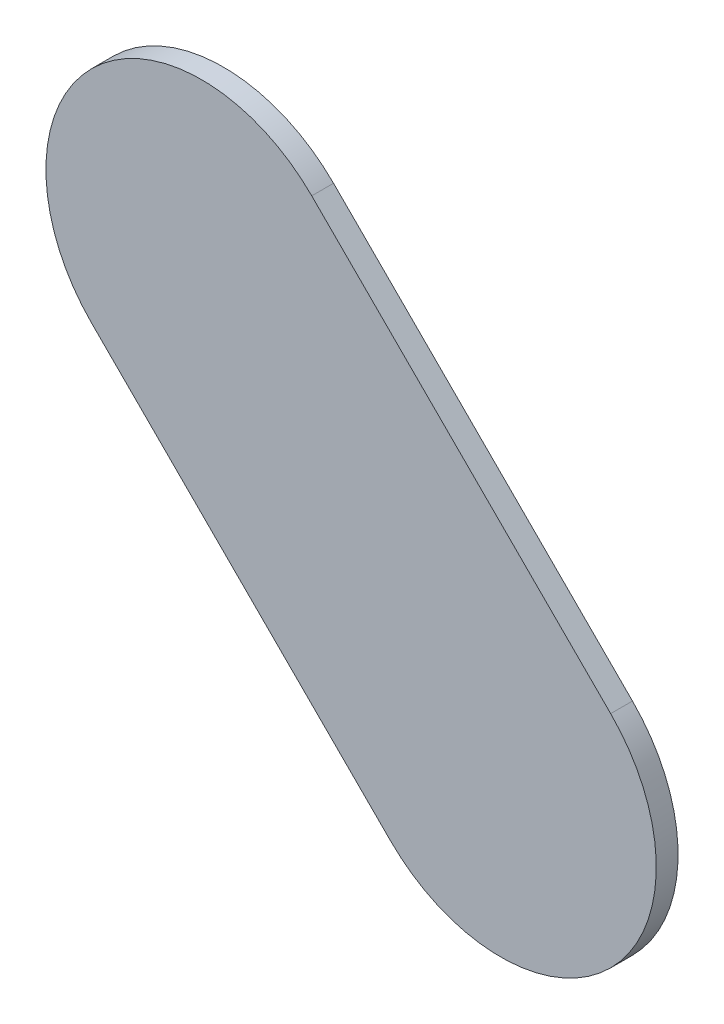
ISO-10303-21;
HEADER;
FILE_DESCRIPTION(('STEP AP214'),'2;1');
FILE_NAME('part.step','',(''),(''),'','','');
FILE_SCHEMA(('AUTOMOTIVE_DESIGN { 1 0 10303 214 1 1 1 1 }'));
ENDSEC;
DATA;
#1=APPLICATION_CONTEXT('core data for automotive mechanical design processes');
#2=APPLICATION_PROTOCOL_DEFINITION('international standard','automotive_design',2000,#1);
#3=PRODUCT_CONTEXT('',#1,'mechanical');
#4=PRODUCT('Part','Part','',(#3));
#5=PRODUCT_RELATED_PRODUCT_CATEGORY('part','',(#4));
#6=PRODUCT_DEFINITION_FORMATION('','',#4);
#7=PRODUCT_DEFINITION_CONTEXT('part definition',#1,'design');
#8=PRODUCT_DEFINITION('design','',#6,#7);
#9=PRODUCT_DEFINITION_SHAPE('','',#8);
#10=(LENGTH_UNIT() NAMED_UNIT(*) SI_UNIT(.MILLI.,.METRE.));
#11=(NAMED_UNIT(*) PLANE_ANGLE_UNIT() SI_UNIT($,.RADIAN.));
#12=(NAMED_UNIT(*) SI_UNIT($,.STERADIAN.) SOLID_ANGLE_UNIT());
#13=UNCERTAINTY_MEASURE_WITH_UNIT(LENGTH_MEASURE(1.E-05),#10,'distance_accuracy_value','');
#14=(GEOMETRIC_REPRESENTATION_CONTEXT(3) GLOBAL_UNCERTAINTY_ASSIGNED_CONTEXT((#13)) GLOBAL_UNIT_ASSIGNED_CONTEXT((#10,
#11,#12)) REPRESENTATION_CONTEXT('',''));
#15=CARTESIAN_POINT('',(0.,0.,0.));
#16=DIRECTION('',(0.,0.,1.));
#17=DIRECTION('',(1.,0.,0.));
#18=AXIS2_PLACEMENT_3D('',#15,#16,#17);
#19=CARTESIAN_POINT('',(101.946777,-122.023223,1.635));
#20=DIRECTION('',(0.,0.,1.));
#21=DIRECTION('',(1.,0.,0.));
#22=AXIS2_PLACEMENT_3D('',#19,#20,#21);
#23=PLANE('',#22);
#24=DIRECTION('',(-0.707106781186548,0.707106781186548,0.));
#25=VECTOR('',#24,1.);
#26=CARTESIAN_POINT('',(101.946777,-122.023223,1.635));
#27=LINE('',#26,#25);
#28=CARTESIAN_POINT('',(101.946777,-122.023223,1.635));
#29=VERTEX_POINT('',#28);
#30=CARTESIAN_POINT('',(101.466776,-121.543222,1.635));
#31=VERTEX_POINT('',#30);
#32=EDGE_CURVE('E72',#29,#31,#27,.T.);
#33=ORIENTED_EDGE('',*,*,#32,.T.);
#34=CARTESIAN_POINT('',(101.2899995,-121.7199985,1.635));
#35=DIRECTION('',(0.,0.,1.));
#36=DIRECTION('',(0.707106781186548,0.707106781186548,0.));
#37=AXIS2_PLACEMENT_3D('',#34,#35,#36);
#38=CIRCLE('',#37,0.249999723809);
#39=CARTESIAN_POINT('',(101.113223,-121.896775,1.635));
#40=VERTEX_POINT('',#39);
#41=EDGE_CURVE('E104',#31,#40,#38,.T.);
#42=ORIENTED_EDGE('',*,*,#41,.T.);
#43=DIRECTION('',(0.707106781186548,-0.707106781186548,0.));
#44=VECTOR('',#43,1.);
#45=CARTESIAN_POINT('',(101.113223,-121.896775,1.635));
#46=LINE('',#45,#44);
#47=CARTESIAN_POINT('',(101.593224,-122.376776,1.635));
#48=VERTEX_POINT('',#47);
#49=EDGE_CURVE('E20',#40,#48,#46,.T.);
#50=ORIENTED_EDGE('',*,*,#49,.T.);
#51=CARTESIAN_POINT('',(101.7700005,-122.1999995,1.635));
#52=DIRECTION('',(0.,0.,1.));
#53=DIRECTION('',(-0.707106781186548,-0.707106781186548,0.));
#54=AXIS2_PLACEMENT_3D('',#51,#52,#53);
#55=CIRCLE('',#54,0.249999723809);
#56=EDGE_CURVE('E11',#48,#29,#55,.T.);
#57=ORIENTED_EDGE('',*,*,#56,.T.);
#58=EDGE_LOOP('',(#33,#42,#50,#57));
#59=FACE_BOUND('',#58,.T.);
#60=ADVANCED_FACE('F17',(#59),#23,.T.);
#61=CARTESIAN_POINT('',(101.946777,-122.023223,1.6));
#62=DIRECTION('',(0.,0.,1.));
#63=DIRECTION('',(1.,0.,0.));
#64=AXIS2_PLACEMENT_3D('',#61,#62,#63);
#65=PLANE('',#64);
#66=CARTESIAN_POINT('',(101.7700005,-122.1999995,1.6));
#67=DIRECTION('',(0.,0.,1.));
#68=DIRECTION('',(-0.707106781186548,-0.707106781186548,0.));
#69=AXIS2_PLACEMENT_3D('',#66,#67,#68);
#70=CIRCLE('',#69,0.249999723809);
#71=CARTESIAN_POINT('',(101.593224,-122.376776,1.6));
#72=VERTEX_POINT('',#71);
#73=CARTESIAN_POINT('',(101.946777,-122.023223,1.6));
#74=VERTEX_POINT('',#73);
#75=EDGE_CURVE('E26',#72,#74,#70,.T.);
#76=ORIENTED_EDGE('',*,*,#75,.F.);
#77=DIRECTION('',(0.707106781186548,-0.707106781186548,0.));
#78=VECTOR('',#77,1.);
#79=CARTESIAN_POINT('',(101.113223,-121.896775,1.6));
#80=LINE('',#79,#78);
#81=CARTESIAN_POINT('',(101.113223,-121.896775,1.6));
#82=VERTEX_POINT('',#81);
#83=EDGE_CURVE('E106',#82,#72,#80,.T.);
#84=ORIENTED_EDGE('',*,*,#83,.F.);
#85=CARTESIAN_POINT('',(101.2899995,-121.7199985,1.6));
#86=DIRECTION('',(0.,0.,1.));
#87=DIRECTION('',(0.707106781186548,0.707106781186548,0.));
#88=AXIS2_PLACEMENT_3D('',#85,#86,#87);
#89=CIRCLE('',#88,0.249999723809);
#90=CARTESIAN_POINT('',(101.466776,-121.543222,1.6));
#91=VERTEX_POINT('',#90);
#92=EDGE_CURVE('E81',#91,#82,#89,.T.);
#93=ORIENTED_EDGE('',*,*,#92,.F.);
#94=DIRECTION('',(-0.707106781186548,0.707106781186548,0.));
#95=VECTOR('',#94,1.);
#96=CARTESIAN_POINT('',(101.946777,-122.023223,1.6));
#97=LINE('',#96,#95);
#98=EDGE_CURVE('E92',#74,#91,#97,.T.);
#99=ORIENTED_EDGE('',*,*,#98,.F.);
#100=EDGE_LOOP('',(#76,#84,#93,#99));
#101=FACE_BOUND('',#100,.T.);
#102=ADVANCED_FACE('F165',(#101),#65,.F.);
#103=CARTESIAN_POINT('',(101.7700005,-122.1999995,1.6));
#104=DIRECTION('',(0.,0.,-1.));
#105=DIRECTION('',(-0.707106781186548,-0.707106781186548,0.));
#106=AXIS2_PLACEMENT_3D('',#103,#104,#105);
#107=CYLINDRICAL_SURFACE('',#106,0.249999723809);
#108=ORIENTED_EDGE('',*,*,#75,.T.);
#109=DIRECTION('',(0.,0.,1.));
#110=VECTOR('',#109,1.);
#111=CARTESIAN_POINT('',(101.946777,-122.023223,1.6));
#112=LINE('',#111,#110);
#113=EDGE_CURVE('E76',#74,#29,#112,.T.);
#114=ORIENTED_EDGE('',*,*,#113,.T.);
#115=ORIENTED_EDGE('',*,*,#56,.F.);
#116=DIRECTION('',(0.,0.,1.));
#117=VECTOR('',#116,1.);
#118=CARTESIAN_POINT('',(101.593224,-122.376776,1.6));
#119=LINE('',#118,#117);
#120=EDGE_CURVE('E110',#72,#48,#119,.T.);
#121=ORIENTED_EDGE('',*,*,#120,.F.);
#122=EDGE_LOOP('',(#108,#114,#115,#121));
#123=FACE_BOUND('',#122,.T.);
#124=ADVANCED_FACE('F77',(#123),#107,.T.);
#125=CARTESIAN_POINT('',(101.113223,-121.896775,1.6));
#126=DIRECTION('',(0.707106781186548,0.707106781186548,0.));
#127=DIRECTION('',(0.,0.,-1.));
#128=AXIS2_PLACEMENT_3D('',#125,#126,#127);
#129=PLANE('',#128);
#130=ORIENTED_EDGE('',*,*,#83,.T.);
#131=ORIENTED_EDGE('',*,*,#120,.T.);
#132=ORIENTED_EDGE('',*,*,#49,.F.);
#133=DIRECTION('',(0.,0.,1.));
#134=VECTOR('',#133,1.);
#135=CARTESIAN_POINT('',(101.113223,-121.896775,1.6));
#136=LINE('',#135,#134);
#137=EDGE_CURVE('E101',#82,#40,#136,.T.);
#138=ORIENTED_EDGE('',*,*,#137,.F.);
#139=EDGE_LOOP('',(#130,#131,#132,#138));
#140=FACE_BOUND('',#139,.T.);
#141=ADVANCED_FACE('F147',(#140),#129,.F.);
#142=CARTESIAN_POINT('',(101.2899995,-121.7199985,1.6));
#143=DIRECTION('',(0.,0.,-1.));
#144=DIRECTION('',(0.707106781186548,0.707106781186548,0.));
#145=AXIS2_PLACEMENT_3D('',#142,#143,#144);
#146=CYLINDRICAL_SURFACE('',#145,0.249999723809);
#147=ORIENTED_EDGE('',*,*,#92,.T.);
#148=ORIENTED_EDGE('',*,*,#137,.T.);
#149=ORIENTED_EDGE('',*,*,#41,.F.);
#150=DIRECTION('',(0.,0.,1.));
#151=VECTOR('',#150,1.);
#152=CARTESIAN_POINT('',(101.466776,-121.543222,1.6));
#153=LINE('',#152,#151);
#154=EDGE_CURVE('E85',#91,#31,#153,.T.);
#155=ORIENTED_EDGE('',*,*,#154,.F.);
#156=EDGE_LOOP('',(#147,#148,#149,#155));
#157=FACE_BOUND('',#156,.T.);
#158=ADVANCED_FACE('F137',(#157),#146,.T.);
#159=CARTESIAN_POINT('',(101.946777,-122.023223,1.6));
#160=DIRECTION('',(-0.707106781186548,-0.707106781186548,0.));
#161=DIRECTION('',(-0.707106781186548,0.707106781186548,0.));
#162=AXIS2_PLACEMENT_3D('',#159,#160,#161);
#163=PLANE('',#162);
#164=ORIENTED_EDGE('',*,*,#98,.T.);
#165=ORIENTED_EDGE('',*,*,#154,.T.);
#166=ORIENTED_EDGE('',*,*,#32,.F.);
#167=ORIENTED_EDGE('',*,*,#113,.F.);
#168=EDGE_LOOP('',(#164,#165,#166,#167));
#169=FACE_BOUND('',#168,.T.);
#170=ADVANCED_FACE('F83',(#169),#163,.F.);
#171=CLOSED_SHELL('',(#60,#102,#124,#141,#158,#170));
#172=MANIFOLD_SOLID_BREP('B1',#171);
#173=ADVANCED_BREP_SHAPE_REPRESENTATION('',(#18,#172),#14);
#174=SHAPE_DEFINITION_REPRESENTATION(#9,#173);
ENDSEC;
END-ISO-10303-21;
